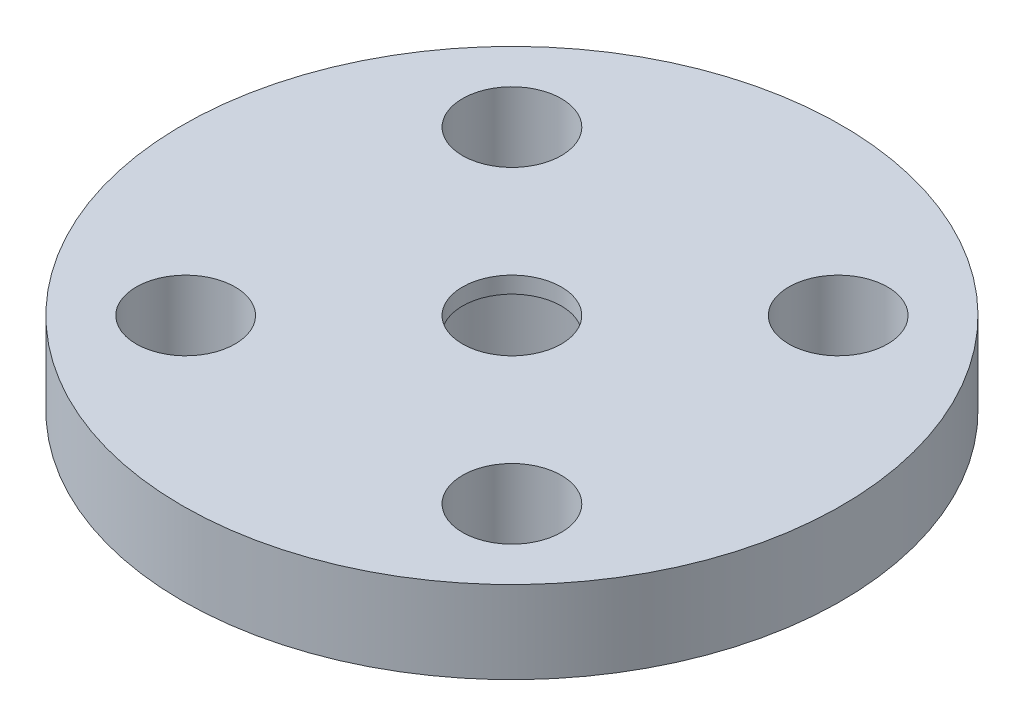
ISO-10303-21;
HEADER;
FILE_DESCRIPTION(('STEP AP214'),'2;1');
FILE_NAME('part.step','',(''),(''),'','','');
FILE_SCHEMA(('AUTOMOTIVE_DESIGN { 1 0 10303 214 1 1 1 1 }'));
ENDSEC;
DATA;
#1=APPLICATION_CONTEXT('core data for automotive mechanical design processes');
#2=APPLICATION_PROTOCOL_DEFINITION('international standard','automotive_design',2000,#1);
#3=PRODUCT_CONTEXT('',#1,'mechanical');
#4=PRODUCT('Part','Part','',(#3));
#5=PRODUCT_RELATED_PRODUCT_CATEGORY('part','',(#4));
#6=PRODUCT_DEFINITION_FORMATION('','',#4);
#7=PRODUCT_DEFINITION_CONTEXT('part definition',#1,'design');
#8=PRODUCT_DEFINITION('design','',#6,#7);
#9=PRODUCT_DEFINITION_SHAPE('','',#8);
#10=(LENGTH_UNIT() NAMED_UNIT(*) SI_UNIT(.MILLI.,.METRE.));
#11=(NAMED_UNIT(*) PLANE_ANGLE_UNIT() SI_UNIT($,.RADIAN.));
#12=(NAMED_UNIT(*) SI_UNIT($,.STERADIAN.) SOLID_ANGLE_UNIT());
#13=UNCERTAINTY_MEASURE_WITH_UNIT(LENGTH_MEASURE(1.E-05),#10,'distance_accuracy_value','');
#14=(GEOMETRIC_REPRESENTATION_CONTEXT(3) GLOBAL_UNCERTAINTY_ASSIGNED_CONTEXT((#13)) GLOBAL_UNIT_ASSIGNED_CONTEXT((#10,
#11,#12)) REPRESENTATION_CONTEXT('',''));
#15=CARTESIAN_POINT('',(0.,0.,0.));
#16=DIRECTION('',(0.,0.,1.));
#17=DIRECTION('',(1.,0.,0.));
#18=AXIS2_PLACEMENT_3D('',#15,#16,#17);
#19=CARTESIAN_POINT('',(0.,2.5,0.));
#20=DIRECTION('',(0.,-1.,0.));
#21=DIRECTION('',(0.,0.,-1.));
#22=AXIS2_PLACEMENT_3D('',#19,#20,#21);
#23=CYLINDRICAL_SURFACE('',#22,1.5);
#24=CARTESIAN_POINT('',(0.,2.5,0.));
#25=DIRECTION('',(0.,1.,0.));
#26=DIRECTION('',(0.,0.,1.));
#27=AXIS2_PLACEMENT_3D('',#24,#25,#26);
#28=CIRCLE('',#27,1.5);
#29=CARTESIAN_POINT('',(0.,2.5,1.5));
#30=VERTEX_POINT('',#29);
#31=EDGE_CURVE('E53',#30,#30,#28,.T.);
#32=ORIENTED_EDGE('',*,*,#31,.T.);
#33=EDGE_LOOP('',(#32));
#34=FACE_BOUND('',#33,.T.);
#35=CARTESIAN_POINT('',(0.,2.,0.));
#36=DIRECTION('',(0.,-1.,0.));
#37=DIRECTION('',(0.,0.,-1.));
#38=AXIS2_PLACEMENT_3D('',#35,#36,#37);
#39=CIRCLE('',#38,1.5);
#40=CARTESIAN_POINT('',(0.,2.,-1.5));
#41=VERTEX_POINT('',#40);
#42=EDGE_CURVE('E41',#41,#41,#39,.T.);
#43=ORIENTED_EDGE('',*,*,#42,.T.);
#44=EDGE_LOOP('',(#43));
#45=FACE_BOUND('',#44,.T.);
#46=ADVANCED_FACE('F37',(#34,#45),#23,.F.);
#47=CARTESIAN_POINT('',(0.,2.5,0.));
#48=DIRECTION('',(0.,1.,0.));
#49=DIRECTION('',(0.,0.,1.));
#50=AXIS2_PLACEMENT_3D('',#47,#48,#49);
#51=PLANE('',#50);
#52=CARTESIAN_POINT('',(4.94974746830583,2.5,4.94974746830583));
#53=DIRECTION('',(0.,1.,0.));
#54=DIRECTION('',(0.,0.,1.));
#55=AXIS2_PLACEMENT_3D('',#52,#53,#54);
#56=CIRCLE('',#55,1.5);
#57=CARTESIAN_POINT('',(4.94974746830583,2.5,6.44974746830583));
#58=VERTEX_POINT('',#57);
#59=EDGE_CURVE('E67',#58,#58,#56,.T.);
#60=ORIENTED_EDGE('',*,*,#59,.F.);
#61=EDGE_LOOP('',(#60));
#62=FACE_BOUND('',#61,.T.);
#63=CARTESIAN_POINT('',(-4.94974746830583,2.5,-4.94974746830583));
#64=DIRECTION('',(0.,1.,0.));
#65=DIRECTION('',(0.,0.,1.));
#66=AXIS2_PLACEMENT_3D('',#63,#64,#65);
#67=CIRCLE('',#66,1.5);
#68=CARTESIAN_POINT('',(-4.94974746830583,2.5,-3.44974746830583));
#69=VERTEX_POINT('',#68);
#70=EDGE_CURVE('E57',#69,#69,#67,.T.);
#71=ORIENTED_EDGE('',*,*,#70,.F.);
#72=EDGE_LOOP('',(#71));
#73=FACE_BOUND('',#72,.T.);
#74=CARTESIAN_POINT('',(0.,2.5,0.));
#75=DIRECTION('',(0.,1.,0.));
#76=DIRECTION('',(0.,0.,1.));
#77=AXIS2_PLACEMENT_3D('',#74,#75,#76);
#78=CIRCLE('',#77,10.);
#79=CARTESIAN_POINT('',(0.,2.5,10.));
#80=VERTEX_POINT('',#79);
#81=EDGE_CURVE('E45',#80,#80,#78,.T.);
#82=ORIENTED_EDGE('',*,*,#81,.T.);
#83=EDGE_LOOP('',(#82));
#84=FACE_BOUND('',#83,.T.);
#85=ORIENTED_EDGE('',*,*,#31,.F.);
#86=EDGE_LOOP('',(#85));
#87=FACE_BOUND('',#86,.T.);
#88=CARTESIAN_POINT('',(4.94974746830583,2.5,-4.94974746830583));
#89=DIRECTION('',(0.,1.,0.));
#90=DIRECTION('',(0.,0.,1.));
#91=AXIS2_PLACEMENT_3D('',#88,#89,#90);
#92=CIRCLE('',#91,1.5);
#93=CARTESIAN_POINT('',(4.94974746830583,2.5,-3.44974746830583));
#94=VERTEX_POINT('',#93);
#95=EDGE_CURVE('E61',#94,#94,#92,.T.);
#96=ORIENTED_EDGE('',*,*,#95,.F.);
#97=EDGE_LOOP('',(#96));
#98=FACE_BOUND('',#97,.T.);
#99=CARTESIAN_POINT('',(-4.94974746830583,2.5,4.94974746830583));
#100=DIRECTION('',(0.,1.,0.));
#101=DIRECTION('',(0.,0.,1.));
#102=AXIS2_PLACEMENT_3D('',#99,#100,#101);
#103=CIRCLE('',#102,1.5);
#104=CARTESIAN_POINT('',(-4.94974746830583,2.5,6.44974746830583));
#105=VERTEX_POINT('',#104);
#106=EDGE_CURVE('E73',#105,#105,#103,.T.);
#107=ORIENTED_EDGE('',*,*,#106,.F.);
#108=EDGE_LOOP('',(#107));
#109=FACE_BOUND('',#108,.T.);
#110=ADVANCED_FACE('F106',(#62,#73,#84,#87,#98,#109),#51,.T.);
#111=CARTESIAN_POINT('',(0.,0.,0.));
#112=DIRECTION('',(0.,1.,0.));
#113=DIRECTION('',(0.,0.,1.));
#114=AXIS2_PLACEMENT_3D('',#111,#112,#113);
#115=PLANE('',#114);
#116=CARTESIAN_POINT('',(0.,0.,0.));
#117=DIRECTION('',(0.,1.,0.));
#118=DIRECTION('',(0.,0.,1.));
#119=AXIS2_PLACEMENT_3D('',#116,#117,#118);
#120=CIRCLE('',#119,4.5);
#121=CARTESIAN_POINT('',(0.,0.,4.5));
#122=VERTEX_POINT('',#121);
#123=EDGE_CURVE('E10',#122,#122,#120,.F.);
#124=ORIENTED_EDGE('',*,*,#123,.F.);
#125=EDGE_LOOP('',(#124));
#126=FACE_BOUND('',#125,.T.);
#127=CARTESIAN_POINT('',(0.,0.,0.));
#128=DIRECTION('',(0.,1.,0.));
#129=DIRECTION('',(0.,0.,1.));
#130=AXIS2_PLACEMENT_3D('',#127,#128,#129);
#131=CIRCLE('',#130,10.);
#132=CARTESIAN_POINT('',(0.,0.,10.));
#133=VERTEX_POINT('',#132);
#134=EDGE_CURVE('E49',#133,#133,#131,.T.);
#135=ORIENTED_EDGE('',*,*,#134,.F.);
#136=EDGE_LOOP('',(#135));
#137=FACE_BOUND('',#136,.T.);
#138=CARTESIAN_POINT('',(-4.94974746830583,0.,-4.94974746830583));
#139=DIRECTION('',(0.,1.,0.));
#140=DIRECTION('',(0.,0.,1.));
#141=AXIS2_PLACEMENT_3D('',#138,#139,#140);
#142=CIRCLE('',#141,1.5);
#143=CARTESIAN_POINT('',(-4.94974746830583,0.,-3.44974746830583));
#144=VERTEX_POINT('',#143);
#145=EDGE_CURVE('E58',#144,#144,#142,.T.);
#146=ORIENTED_EDGE('',*,*,#145,.T.);
#147=EDGE_LOOP('',(#146));
#148=FACE_BOUND('',#147,.T.);
#149=CARTESIAN_POINT('',(4.94974746830583,0.,-4.94974746830583));
#150=DIRECTION('',(0.,1.,0.));
#151=DIRECTION('',(0.,0.,1.));
#152=AXIS2_PLACEMENT_3D('',#149,#150,#151);
#153=CIRCLE('',#152,1.5);
#154=CARTESIAN_POINT('',(4.94974746830583,0.,-3.44974746830583));
#155=VERTEX_POINT('',#154);
#156=EDGE_CURVE('E64',#155,#155,#153,.T.);
#157=ORIENTED_EDGE('',*,*,#156,.T.);
#158=EDGE_LOOP('',(#157));
#159=FACE_BOUND('',#158,.T.);
#160=CARTESIAN_POINT('',(4.94974746830583,0.,4.94974746830583));
#161=DIRECTION('',(0.,1.,0.));
#162=DIRECTION('',(0.,0.,1.));
#163=AXIS2_PLACEMENT_3D('',#160,#161,#162);
#164=CIRCLE('',#163,1.5);
#165=CARTESIAN_POINT('',(4.94974746830583,0.,6.44974746830583));
#166=VERTEX_POINT('',#165);
#167=EDGE_CURVE('E70',#166,#166,#164,.T.);
#168=ORIENTED_EDGE('',*,*,#167,.T.);
#169=EDGE_LOOP('',(#168));
#170=FACE_BOUND('',#169,.T.);
#171=CARTESIAN_POINT('',(-4.94974746830583,0.,4.94974746830583));
#172=DIRECTION('',(0.,1.,0.));
#173=DIRECTION('',(0.,0.,1.));
#174=AXIS2_PLACEMENT_3D('',#171,#172,#173);
#175=CIRCLE('',#174,1.5);
#176=CARTESIAN_POINT('',(-4.94974746830583,0.,6.44974746830583));
#177=VERTEX_POINT('',#176);
#178=EDGE_CURVE('E76',#177,#177,#175,.T.);
#179=ORIENTED_EDGE('',*,*,#178,.T.);
#180=EDGE_LOOP('',(#179));
#181=FACE_BOUND('',#180,.T.);
#182=ADVANCED_FACE('F112',(#126,#137,#148,#159,#170,#181),#115,.F.);
#183=CARTESIAN_POINT('',(0.,2.5,0.));
#184=DIRECTION('',(0.,-1.,0.));
#185=DIRECTION('',(0.,0.,-1.));
#186=AXIS2_PLACEMENT_3D('',#183,#184,#185);
#187=CYLINDRICAL_SURFACE('',#186,10.);
#188=ORIENTED_EDGE('',*,*,#81,.F.);
#189=EDGE_LOOP('',(#188));
#190=FACE_BOUND('',#189,.T.);
#191=ORIENTED_EDGE('',*,*,#134,.T.);
#192=EDGE_LOOP('',(#191));
#193=FACE_BOUND('',#192,.T.);
#194=ADVANCED_FACE('F39',(#190,#193),#187,.T.);
#195=CARTESIAN_POINT('',(-4.94974746830583,2.5,-4.94974746830583));
#196=DIRECTION('',(0.,-1.,0.));
#197=DIRECTION('',(0.,0.,-1.));
#198=AXIS2_PLACEMENT_3D('',#195,#196,#197);
#199=CYLINDRICAL_SURFACE('',#198,1.5);
#200=ORIENTED_EDGE('',*,*,#70,.T.);
#201=EDGE_LOOP('',(#200));
#202=FACE_BOUND('',#201,.T.);
#203=ORIENTED_EDGE('',*,*,#145,.F.);
#204=EDGE_LOOP('',(#203));
#205=FACE_BOUND('',#204,.T.);
#206=ADVANCED_FACE('F116',(#202,#205),#199,.F.);
#207=CARTESIAN_POINT('',(4.94974746830583,2.5,-4.94974746830583));
#208=DIRECTION('',(0.,-1.,0.));
#209=DIRECTION('',(0.,0.,-1.));
#210=AXIS2_PLACEMENT_3D('',#207,#208,#209);
#211=CYLINDRICAL_SURFACE('',#210,1.5);
#212=ORIENTED_EDGE('',*,*,#95,.T.);
#213=EDGE_LOOP('',(#212));
#214=FACE_BOUND('',#213,.T.);
#215=ORIENTED_EDGE('',*,*,#156,.F.);
#216=EDGE_LOOP('',(#215));
#217=FACE_BOUND('',#216,.T.);
#218=ADVANCED_FACE('F147',(#214,#217),#211,.F.);
#219=CARTESIAN_POINT('',(4.94974746830583,2.5,4.94974746830583));
#220=DIRECTION('',(0.,-1.,0.));
#221=DIRECTION('',(0.,0.,-1.));
#222=AXIS2_PLACEMENT_3D('',#219,#220,#221);
#223=CYLINDRICAL_SURFACE('',#222,1.5);
#224=ORIENTED_EDGE('',*,*,#59,.T.);
#225=EDGE_LOOP('',(#224));
#226=FACE_BOUND('',#225,.T.);
#227=ORIENTED_EDGE('',*,*,#167,.F.);
#228=EDGE_LOOP('',(#227));
#229=FACE_BOUND('',#228,.T.);
#230=ADVANCED_FACE('F138',(#226,#229),#223,.F.);
#231=CARTESIAN_POINT('',(-4.94974746830583,2.5,4.94974746830583));
#232=DIRECTION('',(0.,-1.,0.));
#233=DIRECTION('',(0.,0.,-1.));
#234=AXIS2_PLACEMENT_3D('',#231,#232,#233);
#235=CYLINDRICAL_SURFACE('',#234,1.5);
#236=ORIENTED_EDGE('',*,*,#106,.T.);
#237=EDGE_LOOP('',(#236));
#238=FACE_BOUND('',#237,.T.);
#239=ORIENTED_EDGE('',*,*,#178,.F.);
#240=EDGE_LOOP('',(#239));
#241=FACE_BOUND('',#240,.T.);
#242=ADVANCED_FACE('F135',(#238,#241),#235,.F.);
#243=CARTESIAN_POINT('',(0.,-2.,0.));
#244=DIRECTION('',(0.,1.,0.));
#245=DIRECTION('',(0.,0.,1.));
#246=AXIS2_PLACEMENT_3D('',#243,#244,#245);
#247=CYLINDRICAL_SURFACE('',#246,4.5);
#248=CARTESIAN_POINT('',(0.,-2.,0.));
#249=DIRECTION('',(0.,-1.,0.));
#250=DIRECTION('',(0.,0.,-1.));
#251=AXIS2_PLACEMENT_3D('',#248,#249,#250);
#252=CIRCLE('',#251,4.5);
#253=CARTESIAN_POINT('',(0.,-2.,-4.5));
#254=VERTEX_POINT('',#253);
#255=EDGE_CURVE('E79',#254,#254,#252,.T.);
#256=ORIENTED_EDGE('',*,*,#255,.F.);
#257=EDGE_LOOP('',(#256));
#258=FACE_BOUND('',#257,.T.);
#259=ORIENTED_EDGE('',*,*,#123,.T.);
#260=EDGE_LOOP('',(#259));
#261=FACE_BOUND('',#260,.T.);
#262=ADVANCED_FACE('F137',(#258,#261),#247,.T.);
#263=CARTESIAN_POINT('',(0.,-2.,0.));
#264=DIRECTION('',(0.,-1.,0.));
#265=DIRECTION('',(0.,0.,-1.));
#266=AXIS2_PLACEMENT_3D('',#263,#264,#265);
#267=PLANE('',#266);
#268=CARTESIAN_POINT('',(0.,-2.,0.));
#269=DIRECTION('',(0.,-1.,0.));
#270=DIRECTION('',(0.,0.,-1.));
#271=AXIS2_PLACEMENT_3D('',#268,#269,#270);
#272=CIRCLE('',#271,2.75);
#273=CARTESIAN_POINT('',(0.,-2.,-2.75));
#274=VERTEX_POINT('',#273);
#275=EDGE_CURVE('E84',#274,#274,#272,.T.);
#276=ORIENTED_EDGE('',*,*,#275,.F.);
#277=EDGE_LOOP('',(#276));
#278=FACE_BOUND('',#277,.T.);
#279=ORIENTED_EDGE('',*,*,#255,.T.);
#280=EDGE_LOOP('',(#279));
#281=FACE_BOUND('',#280,.T.);
#282=ADVANCED_FACE('F102',(#278,#281),#267,.T.);
#283=CARTESIAN_POINT('',(0.,2.,0.));
#284=DIRECTION('',(0.,-1.,0.));
#285=DIRECTION('',(0.,0.,-1.));
#286=AXIS2_PLACEMENT_3D('',#283,#284,#285);
#287=CYLINDRICAL_SURFACE('',#286,2.75);
#288=CARTESIAN_POINT('',(0.,2.,0.));
#289=DIRECTION('',(0.,-1.,0.));
#290=DIRECTION('',(0.,0.,-1.));
#291=AXIS2_PLACEMENT_3D('',#288,#289,#290);
#292=CIRCLE('',#291,2.75);
#293=CARTESIAN_POINT('',(0.,2.,-2.75));
#294=VERTEX_POINT('',#293);
#295=EDGE_CURVE('E87',#294,#294,#292,.T.);
#296=ORIENTED_EDGE('',*,*,#295,.F.);
#297=EDGE_LOOP('',(#296));
#298=FACE_BOUND('',#297,.T.);
#299=ORIENTED_EDGE('',*,*,#275,.T.);
#300=EDGE_LOOP('',(#299));
#301=FACE_BOUND('',#300,.T.);
#302=ADVANCED_FACE('F97',(#298,#301),#287,.F.);
#303=CARTESIAN_POINT('',(0.,2.,0.));
#304=DIRECTION('',(0.,-1.,0.));
#305=DIRECTION('',(0.,0.,-1.));
#306=AXIS2_PLACEMENT_3D('',#303,#304,#305);
#307=PLANE('',#306);
#308=ORIENTED_EDGE('',*,*,#42,.F.);
#309=EDGE_LOOP('',(#308));
#310=FACE_BOUND('',#309,.T.);
#311=ORIENTED_EDGE('',*,*,#295,.T.);
#312=EDGE_LOOP('',(#311));
#313=FACE_BOUND('',#312,.T.);
#314=ADVANCED_FACE('F95',(#310,#313),#307,.T.);
#315=CLOSED_SHELL('',(#46,#110,#182,#194,#206,#218,#230,#242,#262,#282,#302,#314));
#316=MANIFOLD_SOLID_BREP('B2',#315);
#317=ADVANCED_BREP_SHAPE_REPRESENTATION('',(#18,#316),#14);
#318=SHAPE_DEFINITION_REPRESENTATION(#9,#317);
ENDSEC;
END-ISO-10303-21;
